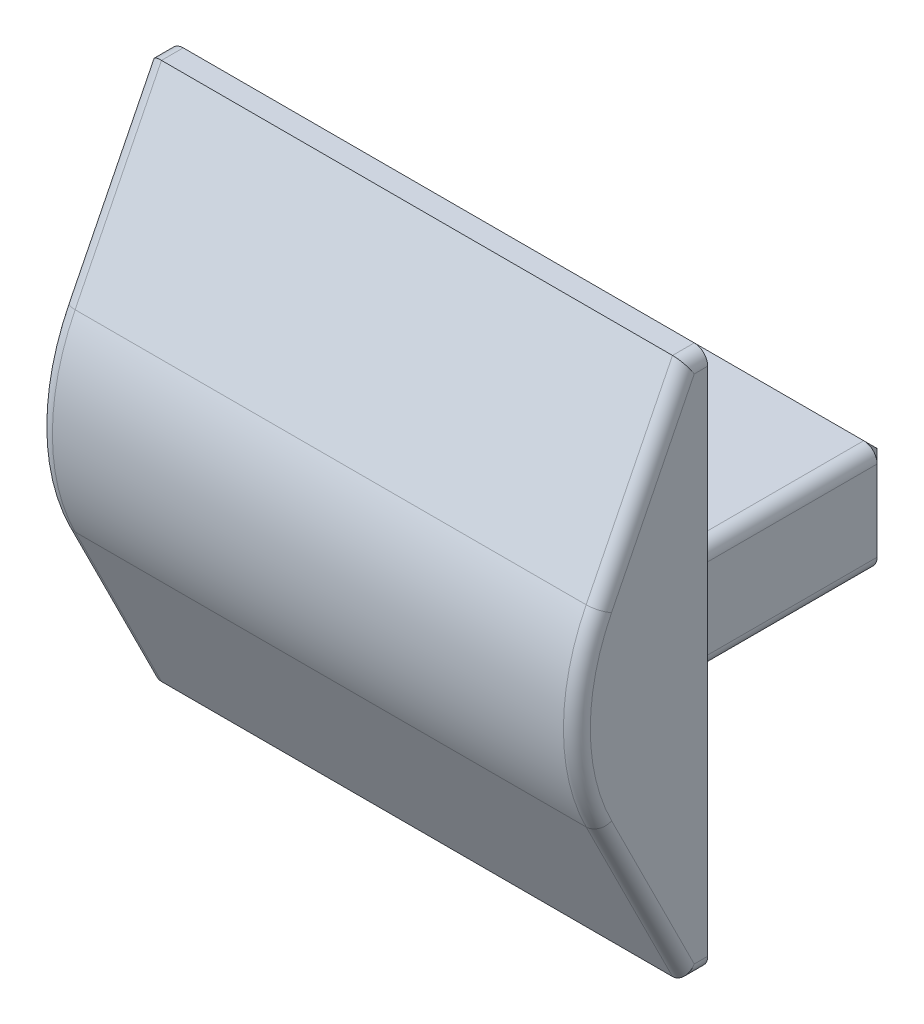
ISO-10303-21;
HEADER;
FILE_DESCRIPTION(('STEP AP214'),'2;1');
FILE_NAME('part.step','',(''),(''),'','','');
FILE_SCHEMA(('AUTOMOTIVE_DESIGN { 1 0 10303 214 1 1 1 1 }'));
ENDSEC;
DATA;
#1=APPLICATION_CONTEXT('core data for automotive mechanical design processes');
#2=APPLICATION_PROTOCOL_DEFINITION('international standard','automotive_design',2000,#1);
#3=PRODUCT_CONTEXT('',#1,'mechanical');
#4=PRODUCT('Part','Part','',(#3));
#5=PRODUCT_RELATED_PRODUCT_CATEGORY('part','',(#4));
#6=PRODUCT_DEFINITION_FORMATION('','',#4);
#7=PRODUCT_DEFINITION_CONTEXT('part definition',#1,'design');
#8=PRODUCT_DEFINITION('design','',#6,#7);
#9=PRODUCT_DEFINITION_SHAPE('','',#8);
#10=(LENGTH_UNIT() NAMED_UNIT(*) SI_UNIT(.MILLI.,.METRE.));
#11=(NAMED_UNIT(*) PLANE_ANGLE_UNIT() SI_UNIT($,.RADIAN.));
#12=(NAMED_UNIT(*) SI_UNIT($,.STERADIAN.) SOLID_ANGLE_UNIT());
#13=UNCERTAINTY_MEASURE_WITH_UNIT(LENGTH_MEASURE(1.E-05),#10,'distance_accuracy_value','');
#14=(GEOMETRIC_REPRESENTATION_CONTEXT(3) GLOBAL_UNCERTAINTY_ASSIGNED_CONTEXT((#13)) GLOBAL_UNIT_ASSIGNED_CONTEXT((#10,
#11,#12)) REPRESENTATION_CONTEXT('',''));
#15=CARTESIAN_POINT('',(0.,0.,0.));
#16=DIRECTION('',(0.,0.,1.));
#17=DIRECTION('',(1.,0.,0.));
#18=AXIS2_PLACEMENT_3D('',#15,#16,#17);
#19=CARTESIAN_POINT('',(57.0231358744697,0.,28.793556796438));
#20=DIRECTION('',(0.,0.,1.));
#21=DIRECTION('',(0.,-1.,0.));
#22=AXIS2_PLACEMENT_3D('',#19,#20,#21);
#23=PLANE('',#22);
#24=DIRECTION('',(0.,-1.,0.));
#25=VECTOR('',#24,1.);
#26=CARTESIAN_POINT('',(15.9400713575457,0.,28.793556796438));
#27=LINE('',#26,#25);
#28=CARTESIAN_POINT('',(15.9400713575457,-858.136577571572,28.7935567964377));
#29=VERTEX_POINT('',#28);
#30=CARTESIAN_POINT('',(15.9400713575457,-877.136577571572,28.7935567964377));
#31=VERTEX_POINT('',#30);
#32=EDGE_CURVE('E369',#29,#31,#27,.T.);
#33=ORIENTED_EDGE('',*,*,#32,.F.);
#34=CARTESIAN_POINT('',(16.4400713575457,-858.136577571572,28.7935567964377));
#35=DIRECTION('',(0.,0.,1.));
#36=DIRECTION('',(0.,-1.,0.));
#37=AXIS2_PLACEMENT_3D('',#34,#35,#36);
#38=CIRCLE('',#37,0.5);
#39=CARTESIAN_POINT('',(16.4400713575457,-857.636577571572,28.7935567964377));
#40=VERTEX_POINT('',#39);
#41=EDGE_CURVE('E232',#29,#40,#38,.F.);
#42=ORIENTED_EDGE('',*,*,#41,.T.);
#43=DIRECTION('',(-1.,0.,0.));
#44=VECTOR('',#43,1.);
#45=CARTESIAN_POINT('',(57.0231358744697,-857.636577571572,28.7935567964377));
#46=LINE('',#45,#44);
#47=CARTESIAN_POINT('',(35.4400713575457,-857.636577571572,28.7935567964377));
#48=VERTEX_POINT('',#47);
#49=EDGE_CURVE('E381',#48,#40,#46,.T.);
#50=ORIENTED_EDGE('',*,*,#49,.F.);
#51=CARTESIAN_POINT('',(35.4400713575457,-858.136577571572,28.7935567964377));
#52=DIRECTION('',(0.,0.,1.));
#53=DIRECTION('',(0.,-1.,0.));
#54=AXIS2_PLACEMENT_3D('',#51,#52,#53);
#55=CIRCLE('',#54,0.5);
#56=CARTESIAN_POINT('',(35.9400713575457,-858.136577571572,28.7935567964377));
#57=VERTEX_POINT('',#56);
#58=EDGE_CURVE('E223',#48,#57,#55,.F.);
#59=ORIENTED_EDGE('',*,*,#58,.T.);
#60=DIRECTION('',(0.,1.,0.));
#61=VECTOR('',#60,1.);
#62=CARTESIAN_POINT('',(35.9400713575457,0.,28.793556796438));
#63=LINE('',#62,#61);
#64=CARTESIAN_POINT('',(35.9400713575457,-877.136577571572,28.7935567964377));
#65=VERTEX_POINT('',#64);
#66=EDGE_CURVE('E205',#65,#57,#63,.T.);
#67=ORIENTED_EDGE('',*,*,#66,.F.);
#68=CARTESIAN_POINT('',(35.4400713575457,-877.136577571572,28.7935567964377));
#69=DIRECTION('',(0.,0.,1.));
#70=DIRECTION('',(0.,-1.,0.));
#71=AXIS2_PLACEMENT_3D('',#68,#69,#70);
#72=CIRCLE('',#71,0.5);
#73=CARTESIAN_POINT('',(35.4400713575457,-877.636577571572,28.7935567964377));
#74=VERTEX_POINT('',#73);
#75=EDGE_CURVE('E219',#65,#74,#72,.F.);
#76=ORIENTED_EDGE('',*,*,#75,.T.);
#77=DIRECTION('',(-1.,0.,0.));
#78=VECTOR('',#77,1.);
#79=CARTESIAN_POINT('',(57.0231358744697,-877.636577571572,28.7935567964377));
#80=LINE('',#79,#78);
#81=CARTESIAN_POINT('',(16.4400713575457,-877.636577571572,28.7935567964377));
#82=VERTEX_POINT('',#81);
#83=EDGE_CURVE('E379',#74,#82,#80,.T.);
#84=ORIENTED_EDGE('',*,*,#83,.T.);
#85=CARTESIAN_POINT('',(16.4400713575457,-877.136577571572,28.7935567964377));
#86=DIRECTION('',(0.,0.,1.));
#87=DIRECTION('',(0.,-1.,0.));
#88=AXIS2_PLACEMENT_3D('',#85,#86,#87);
#89=CIRCLE('',#88,0.5);
#90=EDGE_CURVE('E230',#82,#31,#89,.F.);
#91=ORIENTED_EDGE('',*,*,#90,.T.);
#92=EDGE_LOOP('',(#33,#42,#50,#59,#67,#76,#84,#91));
#93=FACE_BOUND('',#92,.T.);
#94=DIRECTION('',(0.,-1.,0.));
#95=VECTOR('',#94,1.);
#96=CARTESIAN_POINT('',(34.2400713575457,0.,28.793556796438));
#97=LINE('',#96,#95);
#98=CARTESIAN_POINT('',(34.2400713575457,-866.136577571572,28.7935567964377));
#99=VERTEX_POINT('',#98);
#100=CARTESIAN_POINT('',(34.2400713575457,-869.136577571572,28.7935567964377));
#101=VERTEX_POINT('',#100);
#102=EDGE_CURVE('E363',#99,#101,#97,.T.);
#103=ORIENTED_EDGE('',*,*,#102,.F.);
#104=CARTESIAN_POINT('',(33.7400713575457,-866.136577571572,28.7935567964377));
#105=DIRECTION('',(0.,0.,1.));
#106=DIRECTION('',(0.,-1.,0.));
#107=AXIS2_PLACEMENT_3D('',#104,#105,#106);
#108=CIRCLE('',#107,0.5);
#109=CARTESIAN_POINT('',(33.7400713575457,-865.636577571572,28.7935567964377));
#110=VERTEX_POINT('',#109);
#111=EDGE_CURVE('E271',#99,#110,#108,.T.);
#112=ORIENTED_EDGE('',*,*,#111,.T.);
#113=DIRECTION('',(-1.,0.,0.));
#114=VECTOR('',#113,1.);
#115=CARTESIAN_POINT('',(43.7342184715733,-865.636577571572,28.7935567964377));
#116=LINE('',#115,#114);
#117=CARTESIAN_POINT('',(18.1400713575457,-865.636577571572,28.7935567964377));
#118=VERTEX_POINT('',#117);
#119=EDGE_CURVE('E360',#110,#118,#116,.T.);
#120=ORIENTED_EDGE('',*,*,#119,.T.);
#121=CARTESIAN_POINT('',(18.1400713575457,-866.136577571572,28.7935567964377));
#122=DIRECTION('',(0.,0.,1.));
#123=DIRECTION('',(0.,-1.,0.));
#124=AXIS2_PLACEMENT_3D('',#121,#122,#123);
#125=CIRCLE('',#124,0.5);
#126=CARTESIAN_POINT('',(17.6400713575457,-866.136577571572,28.7935567964377));
#127=VERTEX_POINT('',#126);
#128=EDGE_CURVE('E267',#118,#127,#125,.T.);
#129=ORIENTED_EDGE('',*,*,#128,.T.);
#130=DIRECTION('',(0.,1.,0.));
#131=VECTOR('',#130,1.);
#132=CARTESIAN_POINT('',(17.6400713575457,0.,28.793556796438));
#133=LINE('',#132,#131);
#134=CARTESIAN_POINT('',(17.6400713575457,-869.136577571572,28.7935567964377));
#135=VERTEX_POINT('',#134);
#136=EDGE_CURVE('E285',#135,#127,#133,.T.);
#137=ORIENTED_EDGE('',*,*,#136,.F.);
#138=CARTESIAN_POINT('',(18.1400713575457,-869.136577571572,28.7935567964377));
#139=DIRECTION('',(0.,0.,1.));
#140=DIRECTION('',(0.,-1.,0.));
#141=AXIS2_PLACEMENT_3D('',#138,#139,#140);
#142=CIRCLE('',#141,0.5);
#143=CARTESIAN_POINT('',(18.1400713575457,-869.636577571572,28.7935567964377));
#144=VERTEX_POINT('',#143);
#145=EDGE_CURVE('E265',#135,#144,#142,.T.);
#146=ORIENTED_EDGE('',*,*,#145,.T.);
#147=DIRECTION('',(-1.,0.,0.));
#148=VECTOR('',#147,1.);
#149=CARTESIAN_POINT('',(43.7342184715733,-869.636577571572,28.7935567964377));
#150=LINE('',#149,#148);
#151=CARTESIAN_POINT('',(33.7400713575457,-869.636577571572,28.7935567964377));
#152=VERTEX_POINT('',#151);
#153=EDGE_CURVE('E358',#152,#144,#150,.T.);
#154=ORIENTED_EDGE('',*,*,#153,.F.);
#155=CARTESIAN_POINT('',(33.7400713575457,-869.136577571572,28.7935567964377));
#156=DIRECTION('',(0.,0.,1.));
#157=DIRECTION('',(0.,-1.,0.));
#158=AXIS2_PLACEMENT_3D('',#155,#156,#157);
#159=CIRCLE('',#158,0.5);
#160=EDGE_CURVE('E269',#152,#101,#159,.T.);
#161=ORIENTED_EDGE('',*,*,#160,.T.);
#162=EDGE_LOOP('',(#103,#112,#120,#129,#137,#146,#154,#161));
#163=FACE_BOUND('',#162,.T.);
#164=ADVANCED_FACE('F51',(#93,#163),#23,.F.);
#165=CARTESIAN_POINT('',(57.0231358744697,-867.636577571572,25.6579729903764));
#166=DIRECTION('',(-1.,0.,0.));
#167=DIRECTION('',(0.,0.,1.));
#168=AXIS2_PLACEMENT_3D('',#165,#166,#167);
#169=CYLINDRICAL_SURFACE('',#168,7.99999999999997);
#170=DIRECTION('',(-1.,0.,0.));
#171=VECTOR('',#170,1.);
#172=CARTESIAN_POINT('',(57.0231358744697,-864.058868807572,32.8133905183756));
#173=LINE('',#172,#171);
#174=CARTESIAN_POINT('',(35.4400713575457,-864.058868807572,32.8133905183756));
#175=VERTEX_POINT('',#174);
#176=CARTESIAN_POINT('',(16.4400713575457,-864.058868807572,32.8133905183756));
#177=VERTEX_POINT('',#176);
#178=EDGE_CURVE('E371',#175,#177,#173,.T.);
#179=ORIENTED_EDGE('',*,*,#178,.T.);
#180=CARTESIAN_POINT('',(16.4400713575457,-867.636577571572,25.6579729903764));
#181=DIRECTION('',(1.,0.,0.));
#182=DIRECTION('',(0.,0.,-1.));
#183=AXIS2_PLACEMENT_3D('',#180,#181,#182);
#184=CIRCLE('',#183,7.99999999999997);
#185=CARTESIAN_POINT('',(16.4400713575457,-871.214286335572,32.8133905183754));
#186=VERTEX_POINT('',#185);
#187=EDGE_CURVE('E234',#177,#186,#184,.T.);
#188=ORIENTED_EDGE('',*,*,#187,.T.);
#189=DIRECTION('',(-1.,0.,0.));
#190=VECTOR('',#189,1.);
#191=CARTESIAN_POINT('',(57.0231358744697,-871.214286335572,32.8133905183754));
#192=LINE('',#191,#190);
#193=CARTESIAN_POINT('',(35.4400713575457,-871.214286335572,32.8133905183754));
#194=VERTEX_POINT('',#193);
#195=EDGE_CURVE('E373',#194,#186,#192,.T.);
#196=ORIENTED_EDGE('',*,*,#195,.F.);
#197=CARTESIAN_POINT('',(35.4400713575457,-867.636577571572,25.6579729903764));
#198=DIRECTION('',(1.,0.,0.));
#199=DIRECTION('',(0.,0.,-1.));
#200=AXIS2_PLACEMENT_3D('',#197,#198,#199);
#201=CIRCLE('',#200,7.99999999999997);
#202=EDGE_CURVE('E413',#194,#175,#201,.F.);
#203=ORIENTED_EDGE('',*,*,#202,.T.);
#204=EDGE_LOOP('',(#179,#188,#196,#203));
#205=FACE_BOUND('',#204,.T.);
#206=ADVANCED_FACE('F417',(#205),#169,.T.);
#207=CARTESIAN_POINT('',(57.0231358744697,-187.368213474491,374.736426948947));
#208=DIRECTION('',(0.,-0.447213595499991,0.894427190999899));
#209=DIRECTION('',(0.,-0.894427190999899,-0.447213595499991));
#210=AXIS2_PLACEMENT_3D('',#207,#208,#209);
#211=PLANE('',#210);
#212=DIRECTION('',(-1.,0.,0.));
#213=VECTOR('',#212,1.);
#214=CARTESIAN_POINT('',(57.0231358744697,-877.636577571572,29.6022449003752));
#215=LINE('',#214,#213);
#216=CARTESIAN_POINT('',(35.4400713575457,-877.636577571572,29.6022449003752));
#217=VERTEX_POINT('',#216);
#218=CARTESIAN_POINT('',(16.4400713575457,-877.636577571572,29.6022449003752));
#219=VERTEX_POINT('',#218);
#220=EDGE_CURVE('E376',#217,#219,#215,.T.);
#221=ORIENTED_EDGE('',*,*,#220,.F.);
#222=DIRECTION('',(0.,0.894427190999899,0.447213595499991));
#223=VECTOR('',#222,1.);
#224=CARTESIAN_POINT('',(35.4400713575457,-187.368213474491,374.736426948947));
#225=LINE('',#224,#223);
#226=EDGE_CURVE('E401',#217,#194,#225,.T.);
#227=ORIENTED_EDGE('',*,*,#226,.T.);
#228=ORIENTED_EDGE('',*,*,#195,.T.);
#229=DIRECTION('',(0.,-0.894427190999899,-0.447213595499991));
#230=VECTOR('',#229,1.);
#231=CARTESIAN_POINT('',(16.4400713575457,-877.636577571572,29.6022449003752));
#232=LINE('',#231,#230);
#233=EDGE_CURVE('E398',#186,#219,#232,.T.);
#234=ORIENTED_EDGE('',*,*,#233,.T.);
#235=EDGE_LOOP('',(#221,#227,#228,#234));
#236=FACE_BOUND('',#235,.T.);
#237=ADVANCED_FACE('F425',(#236),#211,.T.);
#238=CARTESIAN_POINT('',(57.0231358744697,-877.636577571572,0.));
#239=DIRECTION('',(0.,-1.,0.));
#240=DIRECTION('',(0.,0.,-1.));
#241=AXIS2_PLACEMENT_3D('',#238,#239,#240);
#242=PLANE('',#241);
#243=ORIENTED_EDGE('',*,*,#220,.T.);
#244=DIRECTION('',(0.,0.,-1.));
#245=VECTOR('',#244,1.);
#246=CARTESIAN_POINT('',(16.4400713575457,-877.636577571572,28.7935567964377));
#247=LINE('',#246,#245);
#248=EDGE_CURVE('E244',#219,#82,#247,.T.);
#249=ORIENTED_EDGE('',*,*,#248,.T.);
#250=ORIENTED_EDGE('',*,*,#83,.F.);
#251=DIRECTION('',(0.,0.,1.));
#252=VECTOR('',#251,1.);
#253=CARTESIAN_POINT('',(35.4400713575457,-877.636577571572,0.));
#254=LINE('',#253,#252);
#255=EDGE_CURVE('E229',#74,#217,#254,.T.);
#256=ORIENTED_EDGE('',*,*,#255,.T.);
#257=EDGE_LOOP('',(#243,#249,#250,#256));
#258=FACE_BOUND('',#257,.T.);
#259=ADVANCED_FACE('F440',(#258),#242,.T.);
#260=CARTESIAN_POINT('',(57.0231358744697,-857.636577571572,0.));
#261=DIRECTION('',(0.,-1.,0.));
#262=DIRECTION('',(0.,0.,-1.));
#263=AXIS2_PLACEMENT_3D('',#260,#261,#262);
#264=PLANE('',#263);
#265=ORIENTED_EDGE('',*,*,#49,.T.);
#266=DIRECTION('',(0.,0.,-1.));
#267=VECTOR('',#266,1.);
#268=CARTESIAN_POINT('',(16.4400713575457,-857.636577571572,0.));
#269=LINE('',#268,#267);
#270=CARTESIAN_POINT('',(16.4400713575457,-857.636577571572,29.6022449003753));
#271=VERTEX_POINT('',#270);
#272=EDGE_CURVE('E241',#40,#271,#269,.F.);
#273=ORIENTED_EDGE('',*,*,#272,.T.);
#274=DIRECTION('',(-1.,0.,0.));
#275=VECTOR('',#274,1.);
#276=CARTESIAN_POINT('',(57.0231358744697,-857.636577571572,29.6022449003753));
#277=LINE('',#276,#275);
#278=CARTESIAN_POINT('',(35.4400713575457,-857.636577571572,29.6022449003753));
#279=VERTEX_POINT('',#278);
#280=EDGE_CURVE('E225',#279,#271,#277,.T.);
#281=ORIENTED_EDGE('',*,*,#280,.F.);
#282=DIRECTION('',(0.,0.,1.));
#283=VECTOR('',#282,1.);
#284=CARTESIAN_POINT('',(35.4400713575457,-857.636577571572,28.7935567964377));
#285=LINE('',#284,#283);
#286=EDGE_CURVE('E239',#279,#48,#285,.F.);
#287=ORIENTED_EDGE('',*,*,#286,.T.);
#288=EDGE_LOOP('',(#265,#273,#281,#287));
#289=FACE_BOUND('',#288,.T.);
#290=ADVANCED_FACE('F459',(#289),#264,.F.);
#291=CARTESIAN_POINT('',(57.0231358744697,-159.686417554188,-319.372835108348));
#292=DIRECTION('',(0.,-0.44721359549999,-0.8944271909999));
#293=DIRECTION('',(0.,0.8944271909999,-0.44721359549999));
#294=AXIS2_PLACEMENT_3D('',#291,#292,#293);
#295=PLANE('',#294);
#296=ORIENTED_EDGE('',*,*,#178,.F.);
#297=DIRECTION('',(0.,-0.8944271909999,0.44721359549999));
#298=VECTOR('',#297,1.);
#299=CARTESIAN_POINT('',(35.4400713575457,-857.636577571572,29.6022449003754));
#300=LINE('',#299,#298);
#301=EDGE_CURVE('E396',#175,#279,#300,.F.);
#302=ORIENTED_EDGE('',*,*,#301,.T.);
#303=ORIENTED_EDGE('',*,*,#280,.T.);
#304=DIRECTION('',(0.,0.8944271909999,-0.44721359549999));
#305=VECTOR('',#304,1.);
#306=CARTESIAN_POINT('',(16.4400713575457,-159.686417554188,-319.372835108348));
#307=LINE('',#306,#305);
#308=EDGE_CURVE('E213',#271,#177,#307,.F.);
#309=ORIENTED_EDGE('',*,*,#308,.T.);
#310=EDGE_LOOP('',(#296,#302,#303,#309));
#311=FACE_BOUND('',#310,.T.);
#312=ADVANCED_FACE('F454',(#311),#295,.F.);
#313=CARTESIAN_POINT('',(35.9400713575457,-703.936577571572,22.7935567964381));
#314=DIRECTION('',(1.,0.,0.));
#315=DIRECTION('',(0.,0.,-1.));
#316=AXIS2_PLACEMENT_3D('',#313,#314,#315);
#317=PLANE('',#316);
#318=DIRECTION('',(0.,0.894427190999899,0.447213595499991));
#319=VECTOR('',#318,1.);
#320=CARTESIAN_POINT('',(35.9400713575457,-741.176446015402,97.2732936840915));
#321=LINE('',#320,#319);
#322=CARTESIAN_POINT('',(35.9400713575457,-870.990679537822,32.3661769228756));
#323=VERTEX_POINT('',#322);
#324=CARTESIAN_POINT('',(35.9400713575457,-877.136577571572,29.2932279060003));
#325=VERTEX_POINT('',#324);
#326=EDGE_CURVE('E208',#323,#325,#321,.F.);
#327=ORIENTED_EDGE('',*,*,#326,.T.);
#328=DIRECTION('',(0.,0.,1.));
#329=VECTOR('',#328,1.);
#330=CARTESIAN_POINT('',(35.9400713575457,-877.136577571572,22.7935567964381));
#331=LINE('',#330,#329);
#332=EDGE_CURVE('E202',#325,#65,#331,.F.);
#333=ORIENTED_EDGE('',*,*,#332,.T.);
#334=ORIENTED_EDGE('',*,*,#66,.T.);
#335=DIRECTION('',(0.,0.,1.));
#336=VECTOR('',#335,1.);
#337=CARTESIAN_POINT('',(35.9400713575457,-858.136577571572,29.6022449003753));
#338=LINE('',#337,#336);
#339=CARTESIAN_POINT('',(35.9400713575457,-858.136577571572,29.2932279060003));
#340=VERTEX_POINT('',#339);
#341=EDGE_CURVE('E224',#57,#340,#338,.T.);
#342=ORIENTED_EDGE('',*,*,#341,.T.);
#343=DIRECTION('',(0.,-0.8944271909999,0.44721359549999));
#344=VECTOR('',#343,1.);
#345=CARTESIAN_POINT('',(35.9400713575457,-864.282475605322,32.3661769228756));
#346=LINE('',#345,#344);
#347=CARTESIAN_POINT('',(35.9400713575457,-864.282475605322,32.3661769228756));
#348=VERTEX_POINT('',#347);
#349=EDGE_CURVE('E389',#340,#348,#346,.T.);
#350=ORIENTED_EDGE('',*,*,#349,.T.);
#351=CARTESIAN_POINT('',(35.9400713575457,-867.636577571572,25.6579729903764));
#352=DIRECTION('',(1.,0.,0.));
#353=DIRECTION('',(0.,0.,-1.));
#354=AXIS2_PLACEMENT_3D('',#351,#352,#353);
#355=CIRCLE('',#354,7.49999999999997);
#356=EDGE_CURVE('E392',#348,#323,#355,.T.);
#357=ORIENTED_EDGE('',*,*,#356,.T.);
#358=EDGE_LOOP('',(#327,#333,#334,#342,#350,#357));
#359=FACE_BOUND('',#358,.T.);
#360=ADVANCED_FACE('F204',(#359),#317,.T.);
#361=CARTESIAN_POINT('',(15.9400713575457,-703.936577571572,22.7935567964381));
#362=DIRECTION('',(1.,0.,0.));
#363=DIRECTION('',(0.,0.,-1.));
#364=AXIS2_PLACEMENT_3D('',#361,#362,#363);
#365=PLANE('',#364);
#366=DIRECTION('',(0.,0.8944271909999,-0.44721359549999));
#367=VECTOR('',#366,1.);
#368=CARTESIAN_POINT('',(15.9400713575457,-732.176709127751,-33.6867063159156));
#369=LINE('',#368,#367);
#370=CARTESIAN_POINT('',(15.9400713575457,-864.282475605322,32.3661769228756));
#371=VERTEX_POINT('',#370);
#372=CARTESIAN_POINT('',(15.9400713575457,-858.136577571572,29.2932279060003));
#373=VERTEX_POINT('',#372);
#374=EDGE_CURVE('E409',#371,#373,#369,.T.);
#375=ORIENTED_EDGE('',*,*,#374,.T.);
#376=DIRECTION('',(0.,0.,-1.));
#377=VECTOR('',#376,1.);
#378=CARTESIAN_POINT('',(15.9400713575457,-858.136577571572,22.7935567964381));
#379=LINE('',#378,#377);
#380=EDGE_CURVE('E411',#373,#29,#379,.T.);
#381=ORIENTED_EDGE('',*,*,#380,.T.);
#382=ORIENTED_EDGE('',*,*,#32,.T.);
#383=DIRECTION('',(0.,0.,-1.));
#384=VECTOR('',#383,1.);
#385=CARTESIAN_POINT('',(15.9400713575457,-877.136577571572,29.6022449003752));
#386=LINE('',#385,#384);
#387=CARTESIAN_POINT('',(15.9400713575457,-877.136577571572,29.2932279060002));
#388=VERTEX_POINT('',#387);
#389=EDGE_CURVE('E403',#31,#388,#386,.F.);
#390=ORIENTED_EDGE('',*,*,#389,.T.);
#391=DIRECTION('',(0.,-0.894427190999899,-0.447213595499991));
#392=VECTOR('',#391,1.);
#393=CARTESIAN_POINT('',(15.9400713575457,-870.990679537822,32.3661769228756));
#394=LINE('',#393,#392);
#395=CARTESIAN_POINT('',(15.9400713575457,-870.990679537822,32.3661769228756));
#396=VERTEX_POINT('',#395);
#397=EDGE_CURVE('E405',#388,#396,#394,.F.);
#398=ORIENTED_EDGE('',*,*,#397,.T.);
#399=CARTESIAN_POINT('',(15.9400713575457,-867.636577571572,25.6579729903764));
#400=DIRECTION('',(1.,0.,0.));
#401=DIRECTION('',(0.,0.,-1.));
#402=AXIS2_PLACEMENT_3D('',#399,#400,#401);
#403=CIRCLE('',#402,7.49999999999997);
#404=EDGE_CURVE('E407',#396,#371,#403,.F.);
#405=ORIENTED_EDGE('',*,*,#404,.T.);
#406=EDGE_LOOP('',(#375,#381,#382,#390,#398,#405));
#407=FACE_BOUND('',#406,.T.);
#408=ADVANCED_FACE('F443',(#407),#365,.F.);
#409=CARTESIAN_POINT('',(43.7342184715733,-869.636577571572,0.));
#410=DIRECTION('',(0.,1.,0.));
#411=DIRECTION('',(0.,0.,1.));
#412=AXIS2_PLACEMENT_3D('',#409,#410,#411);
#413=PLANE('',#412);
#414=DIRECTION('',(0.,0.,-1.));
#415=VECTOR('',#414,1.);
#416=CARTESIAN_POINT('',(18.1400713575457,-869.636577571572,20.2935567964381));
#417=LINE('',#416,#415);
#418=CARTESIAN_POINT('',(18.1400713575457,-869.636577571572,20.7935567964381));
#419=VERTEX_POINT('',#418);
#420=EDGE_CURVE('E248',#144,#419,#417,.T.);
#421=ORIENTED_EDGE('',*,*,#420,.T.);
#422=DIRECTION('',(1.,0.,0.));
#423=VECTOR('',#422,1.);
#424=CARTESIAN_POINT('',(43.7342184715733,-869.636577571572,20.7935567964381));
#425=LINE('',#424,#423);
#426=CARTESIAN_POINT('',(33.7400713575457,-869.636577571572,20.7935567964381));
#427=VERTEX_POINT('',#426);
#428=EDGE_CURVE('E311',#419,#427,#425,.T.);
#429=ORIENTED_EDGE('',*,*,#428,.T.);
#430=DIRECTION('',(0.,0.,1.));
#431=VECTOR('',#430,1.);
#432=CARTESIAN_POINT('',(33.7400713575457,-869.636577571572,0.));
#433=LINE('',#432,#431);
#434=EDGE_CURVE('E246',#427,#152,#433,.T.);
#435=ORIENTED_EDGE('',*,*,#434,.T.);
#436=ORIENTED_EDGE('',*,*,#153,.T.);
#437=EDGE_LOOP('',(#421,#429,#435,#436));
#438=FACE_BOUND('',#437,.T.);
#439=ADVANCED_FACE('F355',(#438),#413,.F.);
#440=CARTESIAN_POINT('',(43.7342184715733,-865.636577571572,0.));
#441=DIRECTION('',(0.,1.,0.));
#442=DIRECTION('',(0.,0.,1.));
#443=AXIS2_PLACEMENT_3D('',#440,#441,#442);
#444=PLANE('',#443);
#445=DIRECTION('',(0.,0.,1.));
#446=VECTOR('',#445,1.);
#447=CARTESIAN_POINT('',(33.7400713575457,-865.636577571572,20.2935567964381));
#448=LINE('',#447,#446);
#449=CARTESIAN_POINT('',(33.7400713575457,-865.636577571572,20.7935567964381));
#450=VERTEX_POINT('',#449);
#451=EDGE_CURVE('E255',#110,#450,#448,.F.);
#452=ORIENTED_EDGE('',*,*,#451,.T.);
#453=DIRECTION('',(-1.,0.,0.));
#454=VECTOR('',#453,1.);
#455=CARTESIAN_POINT('',(18.1400713575457,-865.636577571572,20.7935567964381));
#456=LINE('',#455,#454);
#457=CARTESIAN_POINT('',(18.1400713575457,-865.636577571572,20.7935567964381));
#458=VERTEX_POINT('',#457);
#459=EDGE_CURVE('E313',#450,#458,#456,.T.);
#460=ORIENTED_EDGE('',*,*,#459,.T.);
#461=DIRECTION('',(0.,0.,-1.));
#462=VECTOR('',#461,1.);
#463=CARTESIAN_POINT('',(18.1400713575457,-865.636577571572,0.));
#464=LINE('',#463,#462);
#465=EDGE_CURVE('E258',#458,#118,#464,.F.);
#466=ORIENTED_EDGE('',*,*,#465,.T.);
#467=ORIENTED_EDGE('',*,*,#119,.F.);
#468=EDGE_LOOP('',(#452,#460,#466,#467));
#469=FACE_BOUND('',#468,.T.);
#470=ADVANCED_FACE('F508',(#469),#444,.T.);
#471=CARTESIAN_POINT('',(43.7342184715733,0.,20.2935567964381));
#472=DIRECTION('',(0.,0.,1.));
#473=DIRECTION('',(1.,0.,0.));
#474=AXIS2_PLACEMENT_3D('',#471,#472,#473);
#475=PLANE('',#474);
#476=DIRECTION('',(1.,0.,0.));
#477=VECTOR('',#476,1.);
#478=CARTESIAN_POINT('',(33.7400713575457,-866.136577571572,20.2935567964381));
#479=LINE('',#478,#477);
#480=CARTESIAN_POINT('',(18.1400713575457,-866.136577571572,20.2935567964381));
#481=VERTEX_POINT('',#480);
#482=CARTESIAN_POINT('',(33.7400713575457,-866.136577571572,20.2935567964381));
#483=VERTEX_POINT('',#482);
#484=EDGE_CURVE('E297',#481,#483,#479,.T.);
#485=ORIENTED_EDGE('',*,*,#484,.T.);
#486=DIRECTION('',(0.,-1.,0.));
#487=VECTOR('',#486,1.);
#488=CARTESIAN_POINT('',(33.7400713575457,0.,20.2935567964381));
#489=LINE('',#488,#487);
#490=CARTESIAN_POINT('',(33.7400713575457,-869.136577571572,20.2935567964381));
#491=VERTEX_POINT('',#490);
#492=EDGE_CURVE('E301',#483,#491,#489,.T.);
#493=ORIENTED_EDGE('',*,*,#492,.T.);
#494=DIRECTION('',(-1.,0.,0.));
#495=VECTOR('',#494,1.);
#496=CARTESIAN_POINT('',(43.7342184715733,-869.136577571572,20.2935567964381));
#497=LINE('',#496,#495);
#498=CARTESIAN_POINT('',(18.1400713575457,-869.136577571572,20.2935567964381));
#499=VERTEX_POINT('',#498);
#500=EDGE_CURVE('E299',#491,#499,#497,.T.);
#501=ORIENTED_EDGE('',*,*,#500,.T.);
#502=DIRECTION('',(0.,1.,0.));
#503=VECTOR('',#502,1.);
#504=CARTESIAN_POINT('',(18.1400713575457,-866.136577571572,20.2935567964381));
#505=LINE('',#504,#503);
#506=EDGE_CURVE('E273',#499,#481,#505,.T.);
#507=ORIENTED_EDGE('',*,*,#506,.T.);
#508=EDGE_LOOP('',(#485,#493,#501,#507));
#509=FACE_BOUND('',#508,.T.);
#510=ADVANCED_FACE('F504',(#509),#475,.F.);
#511=CARTESIAN_POINT('',(34.2400713575457,-657.836577571572,0.));
#512=DIRECTION('',(-1.,0.,0.));
#513=DIRECTION('',(0.,0.,1.));
#514=AXIS2_PLACEMENT_3D('',#511,#512,#513);
#515=PLANE('',#514);
#516=DIRECTION('',(0.,0.,1.));
#517=VECTOR('',#516,1.);
#518=CARTESIAN_POINT('',(34.2400713575457,-869.136577571572,0.));
#519=LINE('',#518,#517);
#520=CARTESIAN_POINT('',(34.2400713575457,-869.136577571572,20.7935567964381));
#521=VERTEX_POINT('',#520);
#522=EDGE_CURVE('E262',#101,#521,#519,.F.);
#523=ORIENTED_EDGE('',*,*,#522,.T.);
#524=DIRECTION('',(0.,1.,0.));
#525=VECTOR('',#524,1.);
#526=CARTESIAN_POINT('',(34.2400713575457,-657.836577571572,20.7935567964381));
#527=LINE('',#526,#525);
#528=CARTESIAN_POINT('',(34.2400713575457,-866.136577571572,20.7935567964381));
#529=VERTEX_POINT('',#528);
#530=EDGE_CURVE('E304',#521,#529,#527,.T.);
#531=ORIENTED_EDGE('',*,*,#530,.T.);
#532=DIRECTION('',(0.,0.,1.));
#533=VECTOR('',#532,1.);
#534=CARTESIAN_POINT('',(34.2400713575457,-866.136577571572,28.7935567964377));
#535=LINE('',#534,#533);
#536=EDGE_CURVE('E260',#529,#99,#535,.T.);
#537=ORIENTED_EDGE('',*,*,#536,.T.);
#538=ORIENTED_EDGE('',*,*,#102,.T.);
#539=EDGE_LOOP('',(#523,#531,#537,#538));
#540=FACE_BOUND('',#539,.T.);
#541=ADVANCED_FACE('F507',(#540),#515,.F.);
#542=CARTESIAN_POINT('',(17.6400713575457,-657.836577571572,0.));
#543=DIRECTION('',(-1.,0.,0.));
#544=DIRECTION('',(0.,0.,1.));
#545=AXIS2_PLACEMENT_3D('',#542,#543,#544);
#546=PLANE('',#545);
#547=DIRECTION('',(0.,0.,-1.));
#548=VECTOR('',#547,1.);
#549=CARTESIAN_POINT('',(17.6400713575457,-866.136577571572,0.));
#550=LINE('',#549,#548);
#551=CARTESIAN_POINT('',(17.6400713575457,-866.136577571572,20.7935567964381));
#552=VERTEX_POINT('',#551);
#553=EDGE_CURVE('E251',#127,#552,#550,.T.);
#554=ORIENTED_EDGE('',*,*,#553,.T.);
#555=DIRECTION('',(0.,-1.,0.));
#556=VECTOR('',#555,1.);
#557=CARTESIAN_POINT('',(17.6400713575457,-869.136577571572,20.7935567964381));
#558=LINE('',#557,#556);
#559=CARTESIAN_POINT('',(17.6400713575457,-869.136577571572,20.7935567964381));
#560=VERTEX_POINT('',#559);
#561=EDGE_CURVE('E13',#552,#560,#558,.T.);
#562=ORIENTED_EDGE('',*,*,#561,.T.);
#563=DIRECTION('',(0.,0.,-1.));
#564=VECTOR('',#563,1.);
#565=CARTESIAN_POINT('',(17.6400713575457,-869.136577571572,28.7935567964377));
#566=LINE('',#565,#564);
#567=EDGE_CURVE('E253',#560,#135,#566,.F.);
#568=ORIENTED_EDGE('',*,*,#567,.T.);
#569=ORIENTED_EDGE('',*,*,#136,.T.);
#570=EDGE_LOOP('',(#554,#562,#568,#569));
#571=FACE_BOUND('',#570,.T.);
#572=ADVANCED_FACE('F517',(#571),#546,.T.);
#573=CARTESIAN_POINT('',(35.4400713575457,-877.136577571572,0.));
#574=DIRECTION('',(0.,0.,1.));
#575=DIRECTION('',(1.,0.,0.));
#576=AXIS2_PLACEMENT_3D('',#573,#574,#575);
#577=CYLINDRICAL_SURFACE('',#576,0.5);
#578=ORIENTED_EDGE('',*,*,#75,.F.);
#579=ORIENTED_EDGE('',*,*,#332,.F.);
#580=CARTESIAN_POINT('',(35.4400713575457,-877.136577571572,29.2932279060003));
#581=DIRECTION('',(0.,0.525731112119118,0.85065080835205));
#582=DIRECTION('',(0.,-0.85065080835205,0.525731112119118));
#583=AXIS2_PLACEMENT_3D('',#580,#581,#582);
#584=ELLIPSE('',#583,0.587785252292466,0.5);
#585=EDGE_CURVE('E283',#217,#325,#584,.T.);
#586=ORIENTED_EDGE('',*,*,#585,.F.);
#587=ORIENTED_EDGE('',*,*,#255,.F.);
#588=EDGE_LOOP('',(#578,#579,#586,#587));
#589=FACE_BOUND('',#588,.T.);
#590=ADVANCED_FACE('F228',(#589),#577,.T.);
#591=CARTESIAN_POINT('',(35.4400713575457,-187.144606676741,374.289213353447));
#592=DIRECTION('',(0.,0.894427190999899,0.447213595499991));
#593=DIRECTION('',(0.,-0.447213595499991,0.894427190999899));
#594=AXIS2_PLACEMENT_3D('',#591,#592,#593);
#595=CYLINDRICAL_SURFACE('',#594,0.5);
#596=ORIENTED_EDGE('',*,*,#585,.T.);
#597=ORIENTED_EDGE('',*,*,#326,.F.);
#598=CARTESIAN_POINT('',(35.4400713575457,-870.990679537822,32.3661769228755));
#599=DIRECTION('',(0.,0.89442719099988,0.44721359550003));
#600=DIRECTION('',(0.,-0.44721359550003,0.89442719099988));
#601=AXIS2_PLACEMENT_3D('',#598,#599,#600);
#602=CIRCLE('',#601,0.5);
#603=EDGE_CURVE('E280',#194,#323,#602,.T.);
#604=ORIENTED_EDGE('',*,*,#603,.F.);
#605=ORIENTED_EDGE('',*,*,#226,.F.);
#606=EDGE_LOOP('',(#596,#597,#604,#605));
#607=FACE_BOUND('',#606,.T.);
#608=ADVANCED_FACE('F470',(#607),#595,.T.);
#609=CARTESIAN_POINT('',(35.4400713575457,-858.136577571572,22.7935567964381));
#610=DIRECTION('',(0.,0.,-1.));
#611=DIRECTION('',(-1.,0.,0.));
#612=AXIS2_PLACEMENT_3D('',#609,#610,#611);
#613=CYLINDRICAL_SURFACE('',#612,0.5);
#614=ORIENTED_EDGE('',*,*,#58,.F.);
#615=ORIENTED_EDGE('',*,*,#286,.F.);
#616=CARTESIAN_POINT('',(35.4400713575457,-858.136577571572,29.2932279060003));
#617=DIRECTION('',(0.,0.525731112119118,-0.850650808352049));
#618=DIRECTION('',(0.,-0.850650808352049,-0.525731112119118));
#619=AXIS2_PLACEMENT_3D('',#616,#617,#618);
#620=ELLIPSE('',#619,0.587785252292467,0.5);
#621=EDGE_CURVE('E276',#340,#279,#620,.F.);
#622=ORIENTED_EDGE('',*,*,#621,.F.);
#623=ORIENTED_EDGE('',*,*,#341,.F.);
#624=EDGE_LOOP('',(#614,#615,#622,#623));
#625=FACE_BOUND('',#624,.T.);
#626=ADVANCED_FACE('F462',(#625),#613,.T.);
#627=CARTESIAN_POINT('',(35.4400713575457,-867.636577571572,25.6579729903764));
#628=DIRECTION('',(1.,0.,0.));
#629=DIRECTION('',(0.,0.,-1.));
#630=AXIS2_PLACEMENT_3D('',#627,#628,#629);
#631=TOROIDAL_SURFACE('',#630,7.49999999999997,0.5);
#632=ORIENTED_EDGE('',*,*,#603,.T.);
#633=ORIENTED_EDGE('',*,*,#356,.F.);
#634=CARTESIAN_POINT('',(35.4400713575457,-864.282475605322,32.3661769228756));
#635=DIRECTION('',(0.,0.89442719099988,-0.44721359550003));
#636=DIRECTION('',(0.,0.44721359550003,0.89442719099988));
#637=AXIS2_PLACEMENT_3D('',#634,#635,#636);
#638=CIRCLE('',#637,0.5);
#639=EDGE_CURVE('E274',#175,#348,#638,.T.);
#640=ORIENTED_EDGE('',*,*,#639,.F.);
#641=ORIENTED_EDGE('',*,*,#202,.F.);
#642=EDGE_LOOP('',(#632,#633,#640,#641));
#643=FACE_BOUND('',#642,.T.);
#644=ADVANCED_FACE('F472',(#643),#631,.T.);
#645=CARTESIAN_POINT('',(35.4400713575457,-732.176709127751,-33.6867063159156));
#646=DIRECTION('',(0.,0.8944271909999,-0.44721359549999));
#647=DIRECTION('',(0.,0.44721359549999,0.8944271909999));
#648=AXIS2_PLACEMENT_3D('',#645,#646,#647);
#649=CYLINDRICAL_SURFACE('',#648,0.5);
#650=ORIENTED_EDGE('',*,*,#621,.T.);
#651=ORIENTED_EDGE('',*,*,#301,.F.);
#652=ORIENTED_EDGE('',*,*,#639,.T.);
#653=ORIENTED_EDGE('',*,*,#349,.F.);
#654=EDGE_LOOP('',(#650,#651,#652,#653));
#655=FACE_BOUND('',#654,.T.);
#656=ADVANCED_FACE('F465',(#655),#649,.T.);
#657=CARTESIAN_POINT('',(16.4400713575457,-858.136577571572,22.7935567964381));
#658=DIRECTION('',(0.,0.,-1.));
#659=DIRECTION('',(-1.,0.,0.));
#660=AXIS2_PLACEMENT_3D('',#657,#658,#659);
#661=CYLINDRICAL_SURFACE('',#660,0.5);
#662=ORIENTED_EDGE('',*,*,#41,.F.);
#663=ORIENTED_EDGE('',*,*,#380,.F.);
#664=CARTESIAN_POINT('',(16.4400713575457,-858.136577571572,29.2932279060003));
#665=DIRECTION('',(0.,0.525731112119118,-0.850650808352049));
#666=DIRECTION('',(0.,-0.850650808352049,-0.525731112119118));
#667=AXIS2_PLACEMENT_3D('',#664,#665,#666);
#668=ELLIPSE('',#667,0.587785252292467,0.5);
#669=EDGE_CURVE('E277',#271,#373,#668,.F.);
#670=ORIENTED_EDGE('',*,*,#669,.F.);
#671=ORIENTED_EDGE('',*,*,#272,.F.);
#672=EDGE_LOOP('',(#662,#663,#670,#671));
#673=FACE_BOUND('',#672,.T.);
#674=ADVANCED_FACE('F448',(#673),#661,.T.);
#675=CARTESIAN_POINT('',(16.4400713575457,-732.176709127751,-33.6867063159156));
#676=DIRECTION('',(0.,0.8944271909999,-0.44721359549999));
#677=DIRECTION('',(0.,0.44721359549999,0.8944271909999));
#678=AXIS2_PLACEMENT_3D('',#675,#676,#677);
#679=CYLINDRICAL_SURFACE('',#678,0.5);
#680=ORIENTED_EDGE('',*,*,#669,.T.);
#681=ORIENTED_EDGE('',*,*,#374,.F.);
#682=CARTESIAN_POINT('',(16.4400713575457,-864.282475605322,32.3661769228756));
#683=DIRECTION('',(0.,-0.89442719099988,0.44721359550003));
#684=DIRECTION('',(0.,-0.44721359550003,-0.89442719099988));
#685=AXIS2_PLACEMENT_3D('',#682,#683,#684);
#686=CIRCLE('',#685,0.5);
#687=EDGE_CURVE('E291',#177,#371,#686,.T.);
#688=ORIENTED_EDGE('',*,*,#687,.F.);
#689=ORIENTED_EDGE('',*,*,#308,.F.);
#690=EDGE_LOOP('',(#680,#681,#688,#689));
#691=FACE_BOUND('',#690,.T.);
#692=ADVANCED_FACE('F452',(#691),#679,.T.);
#693=CARTESIAN_POINT('',(16.4400713575457,-867.636577571572,25.6579729903764));
#694=DIRECTION('',(1.,0.,0.));
#695=DIRECTION('',(0.,0.,-1.));
#696=AXIS2_PLACEMENT_3D('',#693,#694,#695);
#697=TOROIDAL_SURFACE('',#696,7.49999999999997,0.5);
#698=ORIENTED_EDGE('',*,*,#687,.T.);
#699=ORIENTED_EDGE('',*,*,#404,.F.);
#700=CARTESIAN_POINT('',(16.4400713575457,-870.990679537822,32.3661769228756));
#701=DIRECTION('',(0.,-0.89442719099988,-0.44721359550003));
#702=DIRECTION('',(0.,0.44721359550003,-0.89442719099988));
#703=AXIS2_PLACEMENT_3D('',#700,#701,#702);
#704=CIRCLE('',#703,0.5);
#705=EDGE_CURVE('E288',#186,#396,#704,.T.);
#706=ORIENTED_EDGE('',*,*,#705,.F.);
#707=ORIENTED_EDGE('',*,*,#187,.F.);
#708=EDGE_LOOP('',(#698,#699,#706,#707));
#709=FACE_BOUND('',#708,.T.);
#710=ADVANCED_FACE('F429',(#709),#697,.T.);
#711=CARTESIAN_POINT('',(16.4400713575457,-877.136577571572,0.));
#712=DIRECTION('',(0.,0.,1.));
#713=DIRECTION('',(1.,0.,0.));
#714=AXIS2_PLACEMENT_3D('',#711,#712,#713);
#715=CYLINDRICAL_SURFACE('',#714,0.5);
#716=ORIENTED_EDGE('',*,*,#90,.F.);
#717=ORIENTED_EDGE('',*,*,#248,.F.);
#718=CARTESIAN_POINT('',(16.4400713575457,-877.136577571572,29.2932279060003));
#719=DIRECTION('',(0.,0.525731112119118,0.85065080835205));
#720=DIRECTION('',(0.,-0.85065080835205,0.525731112119118));
#721=AXIS2_PLACEMENT_3D('',#718,#719,#720);
#722=ELLIPSE('',#721,0.587785252292466,0.5);
#723=EDGE_CURVE('E286',#388,#219,#722,.T.);
#724=ORIENTED_EDGE('',*,*,#723,.F.);
#725=ORIENTED_EDGE('',*,*,#389,.F.);
#726=EDGE_LOOP('',(#716,#717,#724,#725));
#727=FACE_BOUND('',#726,.T.);
#728=ADVANCED_FACE('F438',(#727),#715,.T.);
#729=CARTESIAN_POINT('',(16.4400713575457,-187.144606676741,374.289213353447));
#730=DIRECTION('',(0.,0.894427190999899,0.447213595499991));
#731=DIRECTION('',(0.,-0.447213595499991,0.894427190999899));
#732=AXIS2_PLACEMENT_3D('',#729,#730,#731);
#733=CYLINDRICAL_SURFACE('',#732,0.5);
#734=ORIENTED_EDGE('',*,*,#705,.T.);
#735=ORIENTED_EDGE('',*,*,#397,.F.);
#736=ORIENTED_EDGE('',*,*,#723,.T.);
#737=ORIENTED_EDGE('',*,*,#233,.F.);
#738=EDGE_LOOP('',(#734,#735,#736,#737));
#739=FACE_BOUND('',#738,.T.);
#740=ADVANCED_FACE('F432',(#739),#733,.T.);
#741=CARTESIAN_POINT('',(18.1400713575457,-869.136577571572,0.));
#742=DIRECTION('',(0.,0.,1.));
#743=DIRECTION('',(1.,0.,0.));
#744=AXIS2_PLACEMENT_3D('',#741,#742,#743);
#745=CYLINDRICAL_SURFACE('',#744,0.5);
#746=ORIENTED_EDGE('',*,*,#567,.F.);
#747=CARTESIAN_POINT('',(18.1400713575457,-869.136577571572,20.7935567964381));
#748=DIRECTION('',(0.,0.,1.));
#749=DIRECTION('',(1.,0.,0.));
#750=AXIS2_PLACEMENT_3D('',#747,#748,#749);
#751=CIRCLE('',#750,0.5);
#752=EDGE_CURVE('E315',#560,#419,#751,.T.);
#753=ORIENTED_EDGE('',*,*,#752,.T.);
#754=ORIENTED_EDGE('',*,*,#420,.F.);
#755=ORIENTED_EDGE('',*,*,#145,.F.);
#756=EDGE_LOOP('',(#746,#753,#754,#755));
#757=FACE_BOUND('',#756,.T.);
#758=ADVANCED_FACE('F351',(#757),#745,.T.);
#759=CARTESIAN_POINT('',(18.1400713575457,-866.136577571572,0.));
#760=DIRECTION('',(0.,0.,-1.));
#761=DIRECTION('',(-1.,0.,0.));
#762=AXIS2_PLACEMENT_3D('',#759,#760,#761);
#763=CYLINDRICAL_SURFACE('',#762,0.5);
#764=ORIENTED_EDGE('',*,*,#465,.F.);
#765=CARTESIAN_POINT('',(18.1400713575457,-866.136577571572,20.7935567964381));
#766=DIRECTION('',(0.,0.,1.));
#767=DIRECTION('',(1.,0.,0.));
#768=AXIS2_PLACEMENT_3D('',#765,#766,#767);
#769=CIRCLE('',#768,0.5);
#770=EDGE_CURVE('E61',#458,#552,#769,.T.);
#771=ORIENTED_EDGE('',*,*,#770,.T.);
#772=ORIENTED_EDGE('',*,*,#553,.F.);
#773=ORIENTED_EDGE('',*,*,#128,.F.);
#774=EDGE_LOOP('',(#764,#771,#772,#773));
#775=FACE_BOUND('',#774,.T.);
#776=ADVANCED_FACE('F527',(#775),#763,.T.);
#777=CARTESIAN_POINT('',(33.7400713575457,-869.136577571572,0.));
#778=DIRECTION('',(0.,0.,1.));
#779=DIRECTION('',(1.,0.,0.));
#780=AXIS2_PLACEMENT_3D('',#777,#778,#779);
#781=CYLINDRICAL_SURFACE('',#780,0.5);
#782=ORIENTED_EDGE('',*,*,#434,.F.);
#783=CARTESIAN_POINT('',(33.7400713575457,-869.136577571572,20.7935567964381));
#784=DIRECTION('',(0.,0.,1.));
#785=DIRECTION('',(1.,0.,0.));
#786=AXIS2_PLACEMENT_3D('',#783,#784,#785);
#787=CIRCLE('',#786,0.5);
#788=EDGE_CURVE('E307',#427,#521,#787,.T.);
#789=ORIENTED_EDGE('',*,*,#788,.T.);
#790=ORIENTED_EDGE('',*,*,#522,.F.);
#791=ORIENTED_EDGE('',*,*,#160,.F.);
#792=EDGE_LOOP('',(#782,#789,#790,#791));
#793=FACE_BOUND('',#792,.T.);
#794=ADVANCED_FACE('F583',(#793),#781,.T.);
#795=CARTESIAN_POINT('',(33.7400713575457,-866.136577571572,0.));
#796=DIRECTION('',(0.,0.,-1.));
#797=DIRECTION('',(-1.,0.,0.));
#798=AXIS2_PLACEMENT_3D('',#795,#796,#797);
#799=CYLINDRICAL_SURFACE('',#798,0.5);
#800=ORIENTED_EDGE('',*,*,#536,.F.);
#801=CARTESIAN_POINT('',(33.7400713575457,-866.136577571572,20.7935567964381));
#802=DIRECTION('',(0.,0.,1.));
#803=DIRECTION('',(1.,0.,0.));
#804=AXIS2_PLACEMENT_3D('',#801,#802,#803);
#805=CIRCLE('',#804,0.5);
#806=EDGE_CURVE('E309',#529,#450,#805,.T.);
#807=ORIENTED_EDGE('',*,*,#806,.T.);
#808=ORIENTED_EDGE('',*,*,#451,.F.);
#809=ORIENTED_EDGE('',*,*,#111,.F.);
#810=EDGE_LOOP('',(#800,#807,#808,#809));
#811=FACE_BOUND('',#810,.T.);
#812=ADVANCED_FACE('F535',(#811),#799,.T.);
#813=CARTESIAN_POINT('',(18.1400713575457,0.,20.2935567964381));
#814=DIRECTION('',(-0.70710678118655,0.,-0.707106781186545));
#815=DIRECTION('',(0.,-1.,0.));
#816=AXIS2_PLACEMENT_3D('',#813,#814,#815);
#817=PLANE('',#816);
#818=DIRECTION('',(0.707106781186545,0.,-0.70710678118655));
#819=VECTOR('',#818,1.);
#820=CARTESIAN_POINT('',(17.6400713575457,-869.136577571572,20.7935567964381));
#821=LINE('',#820,#819);
#822=EDGE_CURVE('E333',#560,#499,#821,.T.);
#823=ORIENTED_EDGE('',*,*,#822,.F.);
#824=ORIENTED_EDGE('',*,*,#561,.F.);
#825=DIRECTION('',(-0.707106781186545,0.,0.70710678118655));
#826=VECTOR('',#825,1.);
#827=CARTESIAN_POINT('',(18.1400713575457,-866.136577571572,20.2935567964381));
#828=LINE('',#827,#826);
#829=EDGE_CURVE('E56',#481,#552,#828,.T.);
#830=ORIENTED_EDGE('',*,*,#829,.F.);
#831=ORIENTED_EDGE('',*,*,#506,.F.);
#832=EDGE_LOOP('',(#823,#824,#830,#831));
#833=FACE_BOUND('',#832,.T.);
#834=ADVANCED_FACE('F54',(#833),#817,.T.);
#835=CARTESIAN_POINT('',(18.1400713575457,-866.136577571572,20.7935567964381));
#836=DIRECTION('',(0.,0.,1.));
#837=DIRECTION('',(1.,0.,0.));
#838=AXIS2_PLACEMENT_3D('',#835,#836,#837);
#839=CONICAL_SURFACE('',#838,0.500000000000004,0.785398163397445);
#840=ORIENTED_EDGE('',*,*,#829,.T.);
#841=ORIENTED_EDGE('',*,*,#770,.F.);
#842=DIRECTION('',(0.,0.707106781186582,0.707106781186513));
#843=VECTOR('',#842,1.);
#844=CARTESIAN_POINT('',(18.1400713575457,-866.136577571572,20.2935567964381));
#845=LINE('',#844,#843);
#846=EDGE_CURVE('E331',#481,#458,#845,.T.);
#847=ORIENTED_EDGE('',*,*,#846,.F.);
#848=EDGE_LOOP('',(#840,#841,#847));
#849=FACE_BOUND('',#848,.T.);
#850=ADVANCED_FACE('F343',(#849),#839,.T.);
#851=CARTESIAN_POINT('',(18.1400713575457,-869.136577571572,20.7935567964381));
#852=DIRECTION('',(0.,0.,1.));
#853=DIRECTION('',(1.,0.,0.));
#854=AXIS2_PLACEMENT_3D('',#851,#852,#853);
#855=CONICAL_SURFACE('',#854,0.500000000000004,0.785398163397445);
#856=ORIENTED_EDGE('',*,*,#752,.F.);
#857=ORIENTED_EDGE('',*,*,#822,.T.);
#858=DIRECTION('',(0.,0.707106781186582,-0.707106781186513));
#859=VECTOR('',#858,1.);
#860=CARTESIAN_POINT('',(18.1400713575457,-869.636577571572,20.7935567964381));
#861=LINE('',#860,#859);
#862=EDGE_CURVE('E328',#419,#499,#861,.T.);
#863=ORIENTED_EDGE('',*,*,#862,.F.);
#864=EDGE_LOOP('',(#856,#857,#863));
#865=FACE_BOUND('',#864,.T.);
#866=ADVANCED_FACE('F347',(#865),#855,.T.);
#867=CARTESIAN_POINT('',(43.7342184715733,-865.636577571572,20.7935567964381));
#868=DIRECTION('',(0.,0.707106781186513,-0.707106781186582));
#869=DIRECTION('',(1.,0.,0.));
#870=AXIS2_PLACEMENT_3D('',#867,#868,#869);
#871=PLANE('',#870);
#872=ORIENTED_EDGE('',*,*,#846,.T.);
#873=ORIENTED_EDGE('',*,*,#459,.F.);
#874=DIRECTION('',(0.,0.707106781186582,0.707106781186513));
#875=VECTOR('',#874,1.);
#876=CARTESIAN_POINT('',(33.7400713575457,-866.136577571572,20.2935567964381));
#877=LINE('',#876,#875);
#878=EDGE_CURVE('E325',#483,#450,#877,.T.);
#879=ORIENTED_EDGE('',*,*,#878,.F.);
#880=ORIENTED_EDGE('',*,*,#484,.F.);
#881=EDGE_LOOP('',(#872,#873,#879,#880));
#882=FACE_BOUND('',#881,.T.);
#883=ADVANCED_FACE('F556',(#882),#871,.T.);
#884=CARTESIAN_POINT('',(43.7342184715733,-869.136577571572,20.2935567964381));
#885=DIRECTION('',(0.,0.707106781186513,0.707106781186582));
#886=DIRECTION('',(-1.,0.,0.));
#887=AXIS2_PLACEMENT_3D('',#884,#885,#886);
#888=PLANE('',#887);
#889=ORIENTED_EDGE('',*,*,#862,.T.);
#890=ORIENTED_EDGE('',*,*,#500,.F.);
#891=DIRECTION('',(0.,0.707106781186582,-0.707106781186513));
#892=VECTOR('',#891,1.);
#893=CARTESIAN_POINT('',(33.7400713575457,-869.636577571572,20.7935567964381));
#894=LINE('',#893,#892);
#895=EDGE_CURVE('E322',#427,#491,#894,.T.);
#896=ORIENTED_EDGE('',*,*,#895,.F.);
#897=ORIENTED_EDGE('',*,*,#428,.F.);
#898=EDGE_LOOP('',(#889,#890,#896,#897));
#899=FACE_BOUND('',#898,.T.);
#900=ADVANCED_FACE('F554',(#899),#888,.F.);
#901=CARTESIAN_POINT('',(33.7400713575457,-866.136577571572,20.7935567964381));
#902=DIRECTION('',(0.,0.,1.));
#903=DIRECTION('',(1.,0.,0.));
#904=AXIS2_PLACEMENT_3D('',#901,#902,#903);
#905=CONICAL_SURFACE('',#904,0.500000000000004,0.785398163397445);
#906=ORIENTED_EDGE('',*,*,#878,.T.);
#907=ORIENTED_EDGE('',*,*,#806,.F.);
#908=DIRECTION('',(0.707106781186542,0.,0.707106781186552));
#909=VECTOR('',#908,1.);
#910=CARTESIAN_POINT('',(33.7400713575457,-866.136577571572,20.2935567964381));
#911=LINE('',#910,#909);
#912=EDGE_CURVE('E320',#483,#529,#911,.T.);
#913=ORIENTED_EDGE('',*,*,#912,.F.);
#914=EDGE_LOOP('',(#906,#907,#913));
#915=FACE_BOUND('',#914,.T.);
#916=ADVANCED_FACE('F539',(#915),#905,.T.);
#917=CARTESIAN_POINT('',(33.7400713575457,-869.136577571572,20.7935567964381));
#918=DIRECTION('',(0.,0.,1.));
#919=DIRECTION('',(1.,0.,0.));
#920=AXIS2_PLACEMENT_3D('',#917,#918,#919);
#921=CONICAL_SURFACE('',#920,0.500000000000004,0.785398163397445);
#922=ORIENTED_EDGE('',*,*,#788,.F.);
#923=ORIENTED_EDGE('',*,*,#895,.T.);
#924=DIRECTION('',(-0.707106781186542,0.,-0.707106781186552));
#925=VECTOR('',#924,1.);
#926=CARTESIAN_POINT('',(34.2400713575457,-869.136577571572,20.7935567964381));
#927=LINE('',#926,#925);
#928=EDGE_CURVE('E318',#521,#491,#927,.T.);
#929=ORIENTED_EDGE('',*,*,#928,.F.);
#930=EDGE_LOOP('',(#922,#923,#929));
#931=FACE_BOUND('',#930,.T.);
#932=ADVANCED_FACE('F550',(#931),#921,.T.);
#933=CARTESIAN_POINT('',(33.7400713575457,0.,20.2935567964381));
#934=DIRECTION('',(-0.707106781186552,0.,0.707106781186542));
#935=DIRECTION('',(0.,-1.,0.));
#936=AXIS2_PLACEMENT_3D('',#933,#934,#935);
#937=PLANE('',#936);
#938=ORIENTED_EDGE('',*,*,#912,.T.);
#939=ORIENTED_EDGE('',*,*,#530,.F.);
#940=ORIENTED_EDGE('',*,*,#928,.T.);
#941=ORIENTED_EDGE('',*,*,#492,.F.);
#942=EDGE_LOOP('',(#938,#939,#940,#941));
#943=FACE_BOUND('',#942,.T.);
#944=ADVANCED_FACE('F547',(#943),#937,.F.);
#945=CLOSED_SHELL('',(#164,#206,#237,#259,#290,#312,#360,#408,#439,#470,#510,#541,#572,#590,
#608,#626,#644,#656,#674,#692,#710,#728,#740,#758,#776,#794,#812,#834,#850,#866,#883,#900,#916,
#932,#944));
#946=MANIFOLD_SOLID_BREP('B2',#945);
#947=ADVANCED_BREP_SHAPE_REPRESENTATION('',(#18,#946),#14);
#948=SHAPE_DEFINITION_REPRESENTATION(#9,#947);
ENDSEC;
END-ISO-10303-21;
